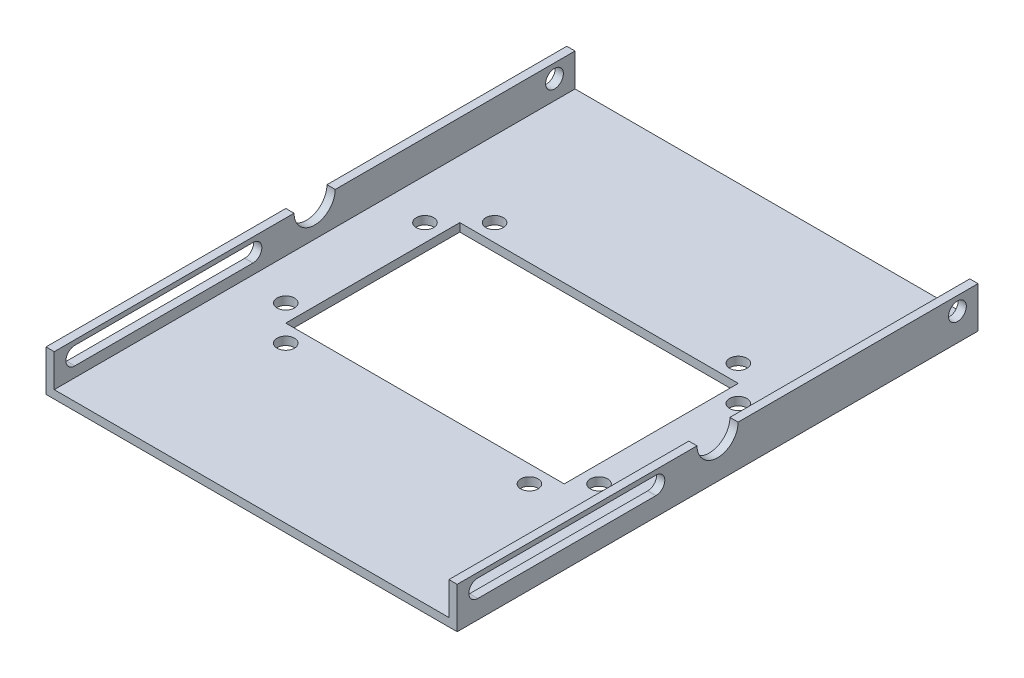
ISO-10303-21;
HEADER;
FILE_DESCRIPTION(('STEP AP214'),'2;1');
FILE_NAME('part.step','',(''),(''),'','','');
FILE_SCHEMA(('AUTOMOTIVE_DESIGN { 1 0 10303 214 1 1 1 1 }'));
ENDSEC;
DATA;
#1=APPLICATION_CONTEXT('core data for automotive mechanical design processes');
#2=APPLICATION_PROTOCOL_DEFINITION('international standard','automotive_design',2000,#1);
#3=PRODUCT_CONTEXT('',#1,'mechanical');
#4=PRODUCT('Part','Part','',(#3));
#5=PRODUCT_RELATED_PRODUCT_CATEGORY('part','',(#4));
#6=PRODUCT_DEFINITION_FORMATION('','',#4);
#7=PRODUCT_DEFINITION_CONTEXT('part definition',#1,'design');
#8=PRODUCT_DEFINITION('design','',#6,#7);
#9=PRODUCT_DEFINITION_SHAPE('','',#8);
#10=(LENGTH_UNIT() NAMED_UNIT(*) SI_UNIT(.MILLI.,.METRE.));
#11=(NAMED_UNIT(*) PLANE_ANGLE_UNIT() SI_UNIT($,.RADIAN.));
#12=(NAMED_UNIT(*) SI_UNIT($,.STERADIAN.) SOLID_ANGLE_UNIT());
#13=UNCERTAINTY_MEASURE_WITH_UNIT(LENGTH_MEASURE(1.E-05),#10,'distance_accuracy_value','');
#14=(GEOMETRIC_REPRESENTATION_CONTEXT(3) GLOBAL_UNCERTAINTY_ASSIGNED_CONTEXT((#13)) GLOBAL_UNIT_ASSIGNED_CONTEXT((#10,
#11,#12)) REPRESENTATION_CONTEXT('',''));
#15=CARTESIAN_POINT('',(0.,0.,0.));
#16=DIRECTION('',(0.,0.,1.));
#17=DIRECTION('',(1.,0.,0.));
#18=AXIS2_PLACEMENT_3D('',#15,#16,#17);
#19=CARTESIAN_POINT('',(-75.,15.,-95.));
#20=DIRECTION('',(0.,-1.,0.));
#21=DIRECTION('',(0.,0.,-1.));
#22=AXIS2_PLACEMENT_3D('',#19,#20,#21);
#23=PLANE('',#22);
#24=DIRECTION('',(0.,0.,1.));
#25=VECTOR('',#24,1.);
#26=CARTESIAN_POINT('',(-75.,15.,-95.));
#27=LINE('',#26,#25);
#28=CARTESIAN_POINT('',(-75.,15.,-95.));
#29=VERTEX_POINT('',#28);
#30=CARTESIAN_POINT('',(-75.,15.,-7.5));
#31=VERTEX_POINT('',#30);
#32=EDGE_CURVE('E390',#29,#31,#27,.T.);
#33=ORIENTED_EDGE('',*,*,#32,.T.);
#34=DIRECTION('',(1.,0.,0.));
#35=VECTOR('',#34,1.);
#36=CARTESIAN_POINT('',(-75.,15.,-7.5));
#37=LINE('',#36,#35);
#38=CARTESIAN_POINT('',(-72.,15.,-7.5));
#39=VERTEX_POINT('',#38);
#40=EDGE_CURVE('E278',#31,#39,#37,.T.);
#41=ORIENTED_EDGE('',*,*,#40,.T.);
#42=DIRECTION('',(0.,0.,1.));
#43=VECTOR('',#42,1.);
#44=CARTESIAN_POINT('',(-72.,15.,-95.));
#45=LINE('',#44,#43);
#46=CARTESIAN_POINT('',(-72.,15.,-95.));
#47=VERTEX_POINT('',#46);
#48=EDGE_CURVE('E394',#47,#39,#45,.T.);
#49=ORIENTED_EDGE('',*,*,#48,.F.);
#50=DIRECTION('',(1.,0.,0.));
#51=VECTOR('',#50,1.);
#52=CARTESIAN_POINT('',(-75.,15.,-95.));
#53=LINE('',#52,#51);
#54=EDGE_CURVE('E376',#29,#47,#53,.T.);
#55=ORIENTED_EDGE('',*,*,#54,.F.);
#56=EDGE_LOOP('',(#33,#41,#49,#55));
#57=FACE_BOUND('',#56,.T.);
#58=ADVANCED_FACE('F44',(#57),#23,.F.);
#59=CARTESIAN_POINT('',(72.,15.,-95.));
#60=DIRECTION('',(0.,-1.,0.));
#61=DIRECTION('',(0.,0.,-1.));
#62=AXIS2_PLACEMENT_3D('',#59,#60,#61);
#63=PLANE('',#62);
#64=DIRECTION('',(0.,0.,1.));
#65=VECTOR('',#64,1.);
#66=CARTESIAN_POINT('',(72.,15.,-95.));
#67=LINE('',#66,#65);
#68=CARTESIAN_POINT('',(72.,15.,-95.));
#69=VERTEX_POINT('',#68);
#70=CARTESIAN_POINT('',(72.,15.,-7.5));
#71=VERTEX_POINT('',#70);
#72=EDGE_CURVE('E402',#69,#71,#67,.T.);
#73=ORIENTED_EDGE('',*,*,#72,.T.);
#74=DIRECTION('',(1.,0.,0.));
#75=VECTOR('',#74,1.);
#76=CARTESIAN_POINT('',(-75.,15.,-7.5));
#77=LINE('',#76,#75);
#78=CARTESIAN_POINT('',(75.,15.,-7.5));
#79=VERTEX_POINT('',#78);
#80=EDGE_CURVE('E13',#71,#79,#77,.T.);
#81=ORIENTED_EDGE('',*,*,#80,.T.);
#82=DIRECTION('',(0.,0.,1.));
#83=VECTOR('',#82,1.);
#84=CARTESIAN_POINT('',(75.,15.,-95.));
#85=LINE('',#84,#83);
#86=CARTESIAN_POINT('',(75.,15.,-95.));
#87=VERTEX_POINT('',#86);
#88=EDGE_CURVE('E406',#87,#79,#85,.T.);
#89=ORIENTED_EDGE('',*,*,#88,.F.);
#90=DIRECTION('',(1.,0.,0.));
#91=VECTOR('',#90,1.);
#92=CARTESIAN_POINT('',(72.,15.,-95.));
#93=LINE('',#92,#91);
#94=EDGE_CURVE('E368',#69,#87,#93,.T.);
#95=ORIENTED_EDGE('',*,*,#94,.F.);
#96=EDGE_LOOP('',(#73,#81,#89,#95));
#97=FACE_BOUND('',#96,.T.);
#98=ADVANCED_FACE('F467',(#97),#63,.F.);
#99=CARTESIAN_POINT('',(75.,0.,-95.));
#100=DIRECTION('',(1.,0.,0.));
#101=DIRECTION('',(0.,0.,-1.));
#102=AXIS2_PLACEMENT_3D('',#99,#100,#101);
#103=PLANE('',#102);
#104=CARTESIAN_POINT('',(75.,15.,0.));
#105=DIRECTION('',(1.,0.,0.));
#106=DIRECTION('',(0.,0.,-1.));
#107=AXIS2_PLACEMENT_3D('',#104,#105,#106);
#108=CIRCLE('',#107,7.5);
#109=CARTESIAN_POINT('',(75.,15.,7.5));
#110=VERTEX_POINT('',#109);
#111=EDGE_CURVE('E270',#110,#79,#108,.T.);
#112=ORIENTED_EDGE('',*,*,#111,.F.);
#113=CARTESIAN_POINT('',(75.,15.,95.));
#114=VERTEX_POINT('',#113);
#115=EDGE_CURVE('E384',#110,#114,#85,.T.);
#116=ORIENTED_EDGE('',*,*,#115,.T.);
#117=DIRECTION('',(0.,1.,0.));
#118=VECTOR('',#117,1.);
#119=CARTESIAN_POINT('',(75.,0.,95.));
#120=LINE('',#119,#118);
#121=CARTESIAN_POINT('',(75.,0.,95.));
#122=VERTEX_POINT('',#121);
#123=EDGE_CURVE('E341',#122,#114,#120,.T.);
#124=ORIENTED_EDGE('',*,*,#123,.F.);
#125=DIRECTION('',(0.,0.,1.));
#126=VECTOR('',#125,1.);
#127=CARTESIAN_POINT('',(75.,0.,-95.));
#128=LINE('',#127,#126);
#129=CARTESIAN_POINT('',(75.,0.,-95.));
#130=VERTEX_POINT('',#129);
#131=EDGE_CURVE('E385',#130,#122,#128,.T.);
#132=ORIENTED_EDGE('',*,*,#131,.F.);
#133=DIRECTION('',(0.,1.,0.));
#134=VECTOR('',#133,1.);
#135=CARTESIAN_POINT('',(75.,0.,-95.));
#136=LINE('',#135,#134);
#137=EDGE_CURVE('E365',#130,#87,#136,.T.);
#138=ORIENTED_EDGE('',*,*,#137,.T.);
#139=ORIENTED_EDGE('',*,*,#88,.T.);
#140=EDGE_LOOP('',(#112,#116,#124,#132,#138,#139));
#141=FACE_BOUND('',#140,.T.);
#142=CARTESIAN_POINT('',(75.,10.,-87.5));
#143=DIRECTION('',(-1.,0.,0.));
#144=DIRECTION('',(0.,0.,1.));
#145=AXIS2_PLACEMENT_3D('',#142,#143,#144);
#146=CIRCLE('',#145,3.23850000000001);
#147=CARTESIAN_POINT('',(75.,10.,-84.2615));
#148=VERTEX_POINT('',#147);
#149=EDGE_CURVE('E282',#148,#148,#146,.T.);
#150=ORIENTED_EDGE('',*,*,#149,.T.);
#151=EDGE_LOOP('',(#150));
#152=FACE_BOUND('',#151,.T.);
#153=CARTESIAN_POINT('',(75.,10.,87.5));
#154=DIRECTION('',(-1.,0.,0.));
#155=DIRECTION('',(0.,0.,1.));
#156=AXIS2_PLACEMENT_3D('',#153,#154,#155);
#157=CIRCLE('',#156,3.2385);
#158=CARTESIAN_POINT('',(75.,6.76150000000002,87.5));
#159=VERTEX_POINT('',#158);
#160=CARTESIAN_POINT('',(75.,13.2385,87.5));
#161=VERTEX_POINT('',#160);
#162=EDGE_CURVE('E290',#159,#161,#157,.T.);
#163=ORIENTED_EDGE('',*,*,#162,.T.);
#164=DIRECTION('',(0.,0.,-1.));
#165=VECTOR('',#164,1.);
#166=CARTESIAN_POINT('',(75.,13.2385,87.5));
#167=LINE('',#166,#165);
#168=CARTESIAN_POINT('',(75.,13.2385,22.5));
#169=VERTEX_POINT('',#168);
#170=EDGE_CURVE('E293',#161,#169,#167,.T.);
#171=ORIENTED_EDGE('',*,*,#170,.T.);
#172=CARTESIAN_POINT('',(75.,10.,22.5));
#173=DIRECTION('',(-1.,0.,0.));
#174=DIRECTION('',(0.,0.,1.));
#175=AXIS2_PLACEMENT_3D('',#172,#173,#174);
#176=CIRCLE('',#175,3.2385);
#177=CARTESIAN_POINT('',(75.,6.76150000000001,22.5));
#178=VERTEX_POINT('',#177);
#179=EDGE_CURVE('E297',#169,#178,#176,.T.);
#180=ORIENTED_EDGE('',*,*,#179,.T.);
#181=DIRECTION('',(0.,0.,1.));
#182=VECTOR('',#181,1.);
#183=CARTESIAN_POINT('',(75.,6.76150000000002,87.5));
#184=LINE('',#183,#182);
#185=EDGE_CURVE('E300',#178,#159,#184,.T.);
#186=ORIENTED_EDGE('',*,*,#185,.T.);
#187=EDGE_LOOP('',(#163,#171,#180,#186));
#188=FACE_BOUND('',#187,.T.);
#189=ADVANCED_FACE('F46',(#141,#152,#188),#103,.T.);
#190=CARTESIAN_POINT('',(-75.,0.,-95.));
#191=DIRECTION('',(0.,-1.,0.));
#192=DIRECTION('',(0.,0.,-1.));
#193=AXIS2_PLACEMENT_3D('',#190,#191,#192);
#194=PLANE('',#193);
#195=CARTESIAN_POINT('',(-44.45,0.,-38.1));
#196=DIRECTION('',(0.,-1.,0.));
#197=DIRECTION('',(0.,0.,-1.));
#198=AXIS2_PLACEMENT_3D('',#195,#196,#197);
#199=CIRCLE('',#198,3.175);
#200=CARTESIAN_POINT('',(-44.45,0.,-41.275));
#201=VERTEX_POINT('',#200);
#202=EDGE_CURVE('E261',#201,#201,#199,.T.);
#203=ORIENTED_EDGE('',*,*,#202,.F.);
#204=EDGE_LOOP('',(#203));
#205=FACE_BOUND('',#204,.T.);
#206=CARTESIAN_POINT('',(44.45,0.,-38.1));
#207=DIRECTION('',(0.,-1.,0.));
#208=DIRECTION('',(0.,0.,-1.));
#209=AXIS2_PLACEMENT_3D('',#206,#207,#208);
#210=CIRCLE('',#209,3.175);
#211=CARTESIAN_POINT('',(44.45,0.,-41.275));
#212=VERTEX_POINT('',#211);
#213=EDGE_CURVE('E258',#212,#212,#210,.T.);
#214=ORIENTED_EDGE('',*,*,#213,.F.);
#215=EDGE_LOOP('',(#214));
#216=FACE_BOUND('',#215,.T.);
#217=CARTESIAN_POINT('',(-44.45,0.,38.1));
#218=DIRECTION('',(0.,-1.,0.));
#219=DIRECTION('',(0.,0.,-1.));
#220=AXIS2_PLACEMENT_3D('',#217,#218,#219);
#221=CIRCLE('',#220,3.175);
#222=CARTESIAN_POINT('',(-44.45,0.,34.925));
#223=VERTEX_POINT('',#222);
#224=EDGE_CURVE('E255',#223,#223,#221,.T.);
#225=ORIENTED_EDGE('',*,*,#224,.F.);
#226=EDGE_LOOP('',(#225));
#227=FACE_BOUND('',#226,.T.);
#228=CARTESIAN_POINT('',(44.45,0.,38.1));
#229=DIRECTION('',(0.,-1.,0.));
#230=DIRECTION('',(0.,0.,-1.));
#231=AXIS2_PLACEMENT_3D('',#228,#229,#230);
#232=CIRCLE('',#231,3.175);
#233=CARTESIAN_POINT('',(44.45,0.,34.925));
#234=VERTEX_POINT('',#233);
#235=EDGE_CURVE('E252',#234,#234,#232,.T.);
#236=ORIENTED_EDGE('',*,*,#235,.F.);
#237=EDGE_LOOP('',(#236));
#238=FACE_BOUND('',#237,.T.);
#239=CARTESIAN_POINT('',(-57.15,0.,-25.4));
#240=DIRECTION('',(0.,-1.,0.));
#241=DIRECTION('',(0.,0.,-1.));
#242=AXIS2_PLACEMENT_3D('',#239,#240,#241);
#243=CIRCLE('',#242,3.17499999999997);
#244=CARTESIAN_POINT('',(-57.15,0.,-28.575));
#245=VERTEX_POINT('',#244);
#246=EDGE_CURVE('E249',#245,#245,#243,.T.);
#247=ORIENTED_EDGE('',*,*,#246,.F.);
#248=EDGE_LOOP('',(#247));
#249=FACE_BOUND('',#248,.T.);
#250=CARTESIAN_POINT('',(57.15,0.,-25.4));
#251=DIRECTION('',(0.,-1.,0.));
#252=DIRECTION('',(0.,0.,-1.));
#253=AXIS2_PLACEMENT_3D('',#250,#251,#252);
#254=CIRCLE('',#253,3.175);
#255=CARTESIAN_POINT('',(57.15,0.,-28.575));
#256=VERTEX_POINT('',#255);
#257=EDGE_CURVE('E246',#256,#256,#254,.T.);
#258=ORIENTED_EDGE('',*,*,#257,.F.);
#259=EDGE_LOOP('',(#258));
#260=FACE_BOUND('',#259,.T.);
#261=CARTESIAN_POINT('',(-57.15,0.,25.4));
#262=DIRECTION('',(0.,-1.,0.));
#263=DIRECTION('',(0.,0.,-1.));
#264=AXIS2_PLACEMENT_3D('',#261,#262,#263);
#265=CIRCLE('',#264,3.17499999999996);
#266=CARTESIAN_POINT('',(-57.15,0.,22.225));
#267=VERTEX_POINT('',#266);
#268=EDGE_CURVE('E243',#267,#267,#265,.T.);
#269=ORIENTED_EDGE('',*,*,#268,.F.);
#270=EDGE_LOOP('',(#269));
#271=FACE_BOUND('',#270,.T.);
#272=CARTESIAN_POINT('',(57.15,0.,25.4));
#273=DIRECTION('',(0.,-1.,0.));
#274=DIRECTION('',(0.,0.,-1.));
#275=AXIS2_PLACEMENT_3D('',#272,#273,#274);
#276=CIRCLE('',#275,3.175);
#277=CARTESIAN_POINT('',(57.15,0.,22.225));
#278=VERTEX_POINT('',#277);
#279=EDGE_CURVE('E240',#278,#278,#276,.T.);
#280=ORIENTED_EDGE('',*,*,#279,.F.);
#281=EDGE_LOOP('',(#280));
#282=FACE_BOUND('',#281,.T.);
#283=DIRECTION('',(0.,0.,1.));
#284=VECTOR('',#283,1.);
#285=CARTESIAN_POINT('',(50.8,0.,-95.));
#286=LINE('',#285,#284);
#287=CARTESIAN_POINT('',(50.8,0.,-31.75));
#288=VERTEX_POINT('',#287);
#289=CARTESIAN_POINT('',(50.8,0.,31.75));
#290=VERTEX_POINT('',#289);
#291=EDGE_CURVE('E238',#288,#290,#286,.T.);
#292=ORIENTED_EDGE('',*,*,#291,.F.);
#293=DIRECTION('',(1.,0.,0.));
#294=VECTOR('',#293,1.);
#295=CARTESIAN_POINT('',(-75.,0.,-31.75));
#296=LINE('',#295,#294);
#297=CARTESIAN_POINT('',(-50.8,0.,-31.75));
#298=VERTEX_POINT('',#297);
#299=EDGE_CURVE('E231',#298,#288,#296,.T.);
#300=ORIENTED_EDGE('',*,*,#299,.F.);
#301=DIRECTION('',(0.,0.,-1.));
#302=VECTOR('',#301,1.);
#303=CARTESIAN_POINT('',(-50.8,0.,-95.));
#304=LINE('',#303,#302);
#305=CARTESIAN_POINT('',(-50.8,0.,31.75));
#306=VERTEX_POINT('',#305);
#307=EDGE_CURVE('E211',#306,#298,#304,.T.);
#308=ORIENTED_EDGE('',*,*,#307,.F.);
#309=DIRECTION('',(-1.,0.,0.));
#310=VECTOR('',#309,1.);
#311=CARTESIAN_POINT('',(-75.,0.,31.75));
#312=LINE('',#311,#310);
#313=EDGE_CURVE('E236',#290,#306,#312,.T.);
#314=ORIENTED_EDGE('',*,*,#313,.F.);
#315=EDGE_LOOP('',(#292,#300,#308,#314));
#316=FACE_BOUND('',#315,.T.);
#317=ORIENTED_EDGE('',*,*,#131,.T.);
#318=DIRECTION('',(1.,0.,0.));
#319=VECTOR('',#318,1.);
#320=CARTESIAN_POINT('',(-75.,0.,95.));
#321=LINE('',#320,#319);
#322=CARTESIAN_POINT('',(-75.,0.,95.));
#323=VERTEX_POINT('',#322);
#324=EDGE_CURVE('E362',#323,#122,#321,.T.);
#325=ORIENTED_EDGE('',*,*,#324,.F.);
#326=DIRECTION('',(0.,0.,1.));
#327=VECTOR('',#326,1.);
#328=CARTESIAN_POINT('',(-75.,0.,-95.));
#329=LINE('',#328,#327);
#330=CARTESIAN_POINT('',(-75.,0.,-95.));
#331=VERTEX_POINT('',#330);
#332=EDGE_CURVE('E388',#331,#323,#329,.T.);
#333=ORIENTED_EDGE('',*,*,#332,.F.);
#334=DIRECTION('',(1.,0.,0.));
#335=VECTOR('',#334,1.);
#336=CARTESIAN_POINT('',(-75.,0.,-95.));
#337=LINE('',#336,#335);
#338=EDGE_CURVE('E381',#331,#130,#337,.T.);
#339=ORIENTED_EDGE('',*,*,#338,.T.);
#340=EDGE_LOOP('',(#317,#325,#333,#339));
#341=FACE_BOUND('',#340,.T.);
#342=ADVANCED_FACE('F456',(#205,#216,#227,#238,#249,#260,#271,#282,#316,#341),#194,.T.);
#343=CARTESIAN_POINT('',(-75.,0.,-95.));
#344=DIRECTION('',(-1.,0.,0.));
#345=DIRECTION('',(0.,0.,1.));
#346=AXIS2_PLACEMENT_3D('',#343,#344,#345);
#347=PLANE('',#346);
#348=CARTESIAN_POINT('',(-75.,15.,0.));
#349=DIRECTION('',(1.,0.,0.));
#350=DIRECTION('',(0.,0.,-1.));
#351=AXIS2_PLACEMENT_3D('',#348,#349,#350);
#352=CIRCLE('',#351,7.5);
#353=CARTESIAN_POINT('',(-75.,15.,7.5));
#354=VERTEX_POINT('',#353);
#355=EDGE_CURVE('E264',#354,#31,#352,.T.);
#356=ORIENTED_EDGE('',*,*,#355,.T.);
#357=ORIENTED_EDGE('',*,*,#32,.F.);
#358=DIRECTION('',(0.,-1.,0.));
#359=VECTOR('',#358,1.);
#360=CARTESIAN_POINT('',(-75.,0.,-95.));
#361=LINE('',#360,#359);
#362=EDGE_CURVE('E378',#29,#331,#361,.T.);
#363=ORIENTED_EDGE('',*,*,#362,.T.);
#364=ORIENTED_EDGE('',*,*,#332,.T.);
#365=DIRECTION('',(0.,-1.,0.));
#366=VECTOR('',#365,1.);
#367=CARTESIAN_POINT('',(-75.,0.,95.));
#368=LINE('',#367,#366);
#369=CARTESIAN_POINT('',(-75.,15.,95.));
#370=VERTEX_POINT('',#369);
#371=EDGE_CURVE('E359',#370,#323,#368,.T.);
#372=ORIENTED_EDGE('',*,*,#371,.F.);
#373=EDGE_CURVE('E393',#354,#370,#27,.T.);
#374=ORIENTED_EDGE('',*,*,#373,.F.);
#375=EDGE_LOOP('',(#356,#357,#363,#364,#372,#374));
#376=FACE_BOUND('',#375,.T.);
#377=CARTESIAN_POINT('',(-75.,10.,-87.5));
#378=DIRECTION('',(-1.,0.,0.));
#379=DIRECTION('',(0.,0.,1.));
#380=AXIS2_PLACEMENT_3D('',#377,#378,#379);
#381=CIRCLE('',#380,3.23850000000001);
#382=CARTESIAN_POINT('',(-75.,10.,-84.2615));
#383=VERTEX_POINT('',#382);
#384=EDGE_CURVE('E286',#383,#383,#381,.T.);
#385=ORIENTED_EDGE('',*,*,#384,.F.);
#386=EDGE_LOOP('',(#385));
#387=FACE_BOUND('',#386,.T.);
#388=CARTESIAN_POINT('',(-75.,10.,87.5));
#389=DIRECTION('',(-1.,0.,0.));
#390=DIRECTION('',(0.,0.,1.));
#391=AXIS2_PLACEMENT_3D('',#388,#389,#390);
#392=CIRCLE('',#391,3.2385);
#393=CARTESIAN_POINT('',(-75.,6.76150000000002,87.5));
#394=VERTEX_POINT('',#393);
#395=CARTESIAN_POINT('',(-75.,13.2385,87.5));
#396=VERTEX_POINT('',#395);
#397=EDGE_CURVE('E281',#394,#396,#392,.T.);
#398=ORIENTED_EDGE('',*,*,#397,.F.);
#399=DIRECTION('',(0.,0.,1.));
#400=VECTOR('',#399,1.);
#401=CARTESIAN_POINT('',(-75.,6.76150000000002,87.5));
#402=LINE('',#401,#400);
#403=CARTESIAN_POINT('',(-75.,6.76150000000001,22.5));
#404=VERTEX_POINT('',#403);
#405=EDGE_CURVE('E294',#404,#394,#402,.T.);
#406=ORIENTED_EDGE('',*,*,#405,.F.);
#407=CARTESIAN_POINT('',(-75.,10.,22.5));
#408=DIRECTION('',(-1.,0.,0.));
#409=DIRECTION('',(0.,0.,1.));
#410=AXIS2_PLACEMENT_3D('',#407,#408,#409);
#411=CIRCLE('',#410,3.2385);
#412=CARTESIAN_POINT('',(-75.,13.2385,22.5));
#413=VERTEX_POINT('',#412);
#414=EDGE_CURVE('E308',#413,#404,#411,.T.);
#415=ORIENTED_EDGE('',*,*,#414,.F.);
#416=DIRECTION('',(0.,0.,-1.));
#417=VECTOR('',#416,1.);
#418=CARTESIAN_POINT('',(-75.,13.2385,87.5));
#419=LINE('',#418,#417);
#420=EDGE_CURVE('E305',#396,#413,#419,.T.);
#421=ORIENTED_EDGE('',*,*,#420,.F.);
#422=EDGE_LOOP('',(#398,#406,#415,#421));
#423=FACE_BOUND('',#422,.T.);
#424=ADVANCED_FACE('F451',(#376,#387,#423),#347,.T.);
#425=CARTESIAN_POINT('',(-72.,15.,7.5));
#426=VERTEX_POINT('',#425);
#427=CARTESIAN_POINT('',(-72.,15.,95.));
#428=VERTEX_POINT('',#427);
#429=EDGE_CURVE('E397',#426,#428,#45,.T.);
#430=ORIENTED_EDGE('',*,*,#429,.F.);
#431=DIRECTION('',(1.,0.,0.));
#432=VECTOR('',#431,1.);
#433=CARTESIAN_POINT('',(-75.,15.,7.5));
#434=LINE('',#433,#432);
#435=EDGE_CURVE('E275',#426,#354,#434,.F.);
#436=ORIENTED_EDGE('',*,*,#435,.T.);
#437=ORIENTED_EDGE('',*,*,#373,.T.);
#438=DIRECTION('',(1.,0.,0.));
#439=VECTOR('',#438,1.);
#440=CARTESIAN_POINT('',(-75.,15.,95.));
#441=LINE('',#440,#439);
#442=EDGE_CURVE('E356',#370,#428,#441,.T.);
#443=ORIENTED_EDGE('',*,*,#442,.T.);
#444=EDGE_LOOP('',(#430,#436,#437,#443));
#445=FACE_BOUND('',#444,.T.);
#446=ADVANCED_FACE('F447',(#445),#23,.F.);
#447=CARTESIAN_POINT('',(-72.,0.,-95.));
#448=DIRECTION('',(-1.,0.,0.));
#449=DIRECTION('',(0.,0.,1.));
#450=AXIS2_PLACEMENT_3D('',#447,#448,#449);
#451=PLANE('',#450);
#452=CARTESIAN_POINT('',(-72.,10.,-87.5));
#453=DIRECTION('',(-1.,0.,0.));
#454=DIRECTION('',(0.,0.,1.));
#455=AXIS2_PLACEMENT_3D('',#452,#453,#454);
#456=CIRCLE('',#455,3.23850000000001);
#457=CARTESIAN_POINT('',(-72.,10.,-84.2615));
#458=VERTEX_POINT('',#457);
#459=EDGE_CURVE('E338',#458,#458,#456,.T.);
#460=ORIENTED_EDGE('',*,*,#459,.T.);
#461=EDGE_LOOP('',(#460));
#462=FACE_BOUND('',#461,.T.);
#463=DIRECTION('',(0.,0.,1.));
#464=VECTOR('',#463,1.);
#465=CARTESIAN_POINT('',(-72.,6.7615,-95.));
#466=LINE('',#465,#464);
#467=CARTESIAN_POINT('',(-72.,6.76150000000001,22.5));
#468=VERTEX_POINT('',#467);
#469=CARTESIAN_POINT('',(-72.,6.76150000000002,87.5));
#470=VERTEX_POINT('',#469);
#471=EDGE_CURVE('E331',#468,#470,#466,.T.);
#472=ORIENTED_EDGE('',*,*,#471,.T.);
#473=CARTESIAN_POINT('',(-72.,10.,87.5));
#474=DIRECTION('',(-1.,0.,0.));
#475=DIRECTION('',(0.,0.,1.));
#476=AXIS2_PLACEMENT_3D('',#473,#474,#475);
#477=CIRCLE('',#476,3.2385);
#478=CARTESIAN_POINT('',(-72.,13.2385,87.5));
#479=VERTEX_POINT('',#478);
#480=EDGE_CURVE('E334',#470,#479,#477,.T.);
#481=ORIENTED_EDGE('',*,*,#480,.T.);
#482=DIRECTION('',(0.,0.,-1.));
#483=VECTOR('',#482,1.);
#484=CARTESIAN_POINT('',(-72.,13.2385,-95.));
#485=LINE('',#484,#483);
#486=CARTESIAN_POINT('',(-72.,13.2385,22.5));
#487=VERTEX_POINT('',#486);
#488=EDGE_CURVE('E285',#479,#487,#485,.T.);
#489=ORIENTED_EDGE('',*,*,#488,.T.);
#490=CARTESIAN_POINT('',(-72.,10.,22.5));
#491=DIRECTION('',(-1.,0.,0.));
#492=DIRECTION('',(0.,0.,1.));
#493=AXIS2_PLACEMENT_3D('',#490,#491,#492);
#494=CIRCLE('',#493,3.2385);
#495=EDGE_CURVE('E328',#487,#468,#494,.T.);
#496=ORIENTED_EDGE('',*,*,#495,.T.);
#497=EDGE_LOOP('',(#472,#481,#489,#496));
#498=FACE_BOUND('',#497,.T.);
#499=ORIENTED_EDGE('',*,*,#48,.T.);
#500=CARTESIAN_POINT('',(-72.,15.,0.));
#501=DIRECTION('',(-1.,0.,0.));
#502=DIRECTION('',(0.,0.,1.));
#503=AXIS2_PLACEMENT_3D('',#500,#501,#502);
#504=CIRCLE('',#503,7.5);
#505=EDGE_CURVE('E272',#39,#426,#504,.T.);
#506=ORIENTED_EDGE('',*,*,#505,.T.);
#507=ORIENTED_EDGE('',*,*,#429,.T.);
#508=DIRECTION('',(0.,1.,0.));
#509=VECTOR('',#508,1.);
#510=CARTESIAN_POINT('',(-72.,0.,95.));
#511=LINE('',#510,#509);
#512=CARTESIAN_POINT('',(-72.,3.,95.));
#513=VERTEX_POINT('',#512);
#514=EDGE_CURVE('E353',#428,#513,#511,.F.);
#515=ORIENTED_EDGE('',*,*,#514,.T.);
#516=DIRECTION('',(0.,0.,1.));
#517=VECTOR('',#516,1.);
#518=CARTESIAN_POINT('',(-72.,3.,-95.));
#519=LINE('',#518,#517);
#520=CARTESIAN_POINT('',(-72.,3.,-95.));
#521=VERTEX_POINT('',#520);
#522=EDGE_CURVE('E398',#521,#513,#519,.T.);
#523=ORIENTED_EDGE('',*,*,#522,.F.);
#524=DIRECTION('',(0.,1.,0.));
#525=VECTOR('',#524,1.);
#526=CARTESIAN_POINT('',(-72.,0.,-95.));
#527=LINE('',#526,#525);
#528=EDGE_CURVE('E374',#47,#521,#527,.F.);
#529=ORIENTED_EDGE('',*,*,#528,.F.);
#530=EDGE_LOOP('',(#499,#506,#507,#515,#523,#529));
#531=FACE_BOUND('',#530,.T.);
#532=ADVANCED_FACE('F443',(#462,#498,#531),#451,.F.);
#533=CARTESIAN_POINT('',(-75.,3.,-95.));
#534=DIRECTION('',(0.,-1.,0.));
#535=DIRECTION('',(0.,0.,-1.));
#536=AXIS2_PLACEMENT_3D('',#533,#534,#535);
#537=PLANE('',#536);
#538=CARTESIAN_POINT('',(-44.45,3.,-38.1));
#539=DIRECTION('',(0.,1.,0.));
#540=DIRECTION('',(0.,0.,1.));
#541=AXIS2_PLACEMENT_3D('',#538,#539,#540);
#542=CIRCLE('',#541,3.175);
#543=CARTESIAN_POINT('',(-44.45,3.,-34.925));
#544=VERTEX_POINT('',#543);
#545=EDGE_CURVE('E698',#544,#544,#542,.T.);
#546=ORIENTED_EDGE('',*,*,#545,.F.);
#547=EDGE_LOOP('',(#546));
#548=FACE_BOUND('',#547,.T.);
#549=CARTESIAN_POINT('',(44.45,3.,-38.1));
#550=DIRECTION('',(0.,1.,0.));
#551=DIRECTION('',(0.,0.,1.));
#552=AXIS2_PLACEMENT_3D('',#549,#550,#551);
#553=CIRCLE('',#552,3.175);
#554=CARTESIAN_POINT('',(44.45,3.,-34.925));
#555=VERTEX_POINT('',#554);
#556=EDGE_CURVE('E699',#555,#555,#553,.T.);
#557=ORIENTED_EDGE('',*,*,#556,.F.);
#558=EDGE_LOOP('',(#557));
#559=FACE_BOUND('',#558,.T.);
#560=CARTESIAN_POINT('',(-44.45,3.,38.1));
#561=DIRECTION('',(0.,1.,0.));
#562=DIRECTION('',(0.,0.,1.));
#563=AXIS2_PLACEMENT_3D('',#560,#561,#562);
#564=CIRCLE('',#563,3.175);
#565=CARTESIAN_POINT('',(-44.45,3.,41.275));
#566=VERTEX_POINT('',#565);
#567=EDGE_CURVE('E702',#566,#566,#564,.T.);
#568=ORIENTED_EDGE('',*,*,#567,.F.);
#569=EDGE_LOOP('',(#568));
#570=FACE_BOUND('',#569,.T.);
#571=CARTESIAN_POINT('',(44.45,3.,38.1));
#572=DIRECTION('',(0.,1.,0.));
#573=DIRECTION('',(0.,0.,1.));
#574=AXIS2_PLACEMENT_3D('',#571,#572,#573);
#575=CIRCLE('',#574,3.175);
#576=CARTESIAN_POINT('',(44.45,3.,41.275));
#577=VERTEX_POINT('',#576);
#578=EDGE_CURVE('E710',#577,#577,#575,.T.);
#579=ORIENTED_EDGE('',*,*,#578,.F.);
#580=EDGE_LOOP('',(#579));
#581=FACE_BOUND('',#580,.T.);
#582=CARTESIAN_POINT('',(-57.15,3.,-25.4));
#583=DIRECTION('',(0.,1.,0.));
#584=DIRECTION('',(0.,0.,1.));
#585=AXIS2_PLACEMENT_3D('',#582,#583,#584);
#586=CIRCLE('',#585,3.17499999999997);
#587=CARTESIAN_POINT('',(-57.15,3.,-22.225));
#588=VERTEX_POINT('',#587);
#589=EDGE_CURVE('E712',#588,#588,#586,.T.);
#590=ORIENTED_EDGE('',*,*,#589,.F.);
#591=EDGE_LOOP('',(#590));
#592=FACE_BOUND('',#591,.T.);
#593=CARTESIAN_POINT('',(57.15,3.,-25.4));
#594=DIRECTION('',(0.,1.,0.));
#595=DIRECTION('',(0.,0.,1.));
#596=AXIS2_PLACEMENT_3D('',#593,#594,#595);
#597=CIRCLE('',#596,3.175);
#598=CARTESIAN_POINT('',(57.15,3.,-22.225));
#599=VERTEX_POINT('',#598);
#600=EDGE_CURVE('E716',#599,#599,#597,.T.);
#601=ORIENTED_EDGE('',*,*,#600,.F.);
#602=EDGE_LOOP('',(#601));
#603=FACE_BOUND('',#602,.T.);
#604=CARTESIAN_POINT('',(-57.15,3.,25.4));
#605=DIRECTION('',(0.,1.,0.));
#606=DIRECTION('',(0.,0.,1.));
#607=AXIS2_PLACEMENT_3D('',#604,#605,#606);
#608=CIRCLE('',#607,3.17499999999996);
#609=CARTESIAN_POINT('',(-57.15,3.,28.575));
#610=VERTEX_POINT('',#609);
#611=EDGE_CURVE('E721',#610,#610,#608,.T.);
#612=ORIENTED_EDGE('',*,*,#611,.F.);
#613=EDGE_LOOP('',(#612));
#614=FACE_BOUND('',#613,.T.);
#615=CARTESIAN_POINT('',(57.15,3.,25.4));
#616=DIRECTION('',(0.,1.,0.));
#617=DIRECTION('',(0.,0.,1.));
#618=AXIS2_PLACEMENT_3D('',#615,#616,#617);
#619=CIRCLE('',#618,3.175);
#620=CARTESIAN_POINT('',(57.15,3.,28.575));
#621=VERTEX_POINT('',#620);
#622=EDGE_CURVE('E705',#621,#621,#619,.T.);
#623=ORIENTED_EDGE('',*,*,#622,.F.);
#624=EDGE_LOOP('',(#623));
#625=FACE_BOUND('',#624,.T.);
#626=DIRECTION('',(-1.,0.,0.));
#627=VECTOR('',#626,1.);
#628=CARTESIAN_POINT('',(-50.8,3.,-31.75));
#629=LINE('',#628,#627);
#630=CARTESIAN_POINT('',(50.8,3.,-31.75));
#631=VERTEX_POINT('',#630);
#632=CARTESIAN_POINT('',(-50.8,3.,-31.75));
#633=VERTEX_POINT('',#632);
#634=EDGE_CURVE('E217',#631,#633,#629,.T.);
#635=ORIENTED_EDGE('',*,*,#634,.F.);
#636=DIRECTION('',(0.,0.,-1.));
#637=VECTOR('',#636,1.);
#638=CARTESIAN_POINT('',(50.8,3.,-31.75));
#639=LINE('',#638,#637);
#640=CARTESIAN_POINT('',(50.8,3.,31.75));
#641=VERTEX_POINT('',#640);
#642=EDGE_CURVE('E67',#641,#631,#639,.T.);
#643=ORIENTED_EDGE('',*,*,#642,.F.);
#644=DIRECTION('',(1.,0.,0.));
#645=VECTOR('',#644,1.);
#646=CARTESIAN_POINT('',(-50.8,3.,31.75));
#647=LINE('',#646,#645);
#648=CARTESIAN_POINT('',(-50.8,3.,31.75));
#649=VERTEX_POINT('',#648);
#650=EDGE_CURVE('E224',#649,#641,#647,.T.);
#651=ORIENTED_EDGE('',*,*,#650,.F.);
#652=DIRECTION('',(0.,0.,1.));
#653=VECTOR('',#652,1.);
#654=CARTESIAN_POINT('',(-50.8,3.,-31.75));
#655=LINE('',#654,#653);
#656=EDGE_CURVE('E208',#633,#649,#655,.T.);
#657=ORIENTED_EDGE('',*,*,#656,.F.);
#658=EDGE_LOOP('',(#635,#643,#651,#657));
#659=FACE_BOUND('',#658,.T.);
#660=ORIENTED_EDGE('',*,*,#522,.T.);
#661=DIRECTION('',(1.,0.,0.));
#662=VECTOR('',#661,1.);
#663=CARTESIAN_POINT('',(-75.,3.,95.));
#664=LINE('',#663,#662);
#665=CARTESIAN_POINT('',(72.,3.,95.));
#666=VERTEX_POINT('',#665);
#667=EDGE_CURVE('E350',#513,#666,#664,.T.);
#668=ORIENTED_EDGE('',*,*,#667,.T.);
#669=DIRECTION('',(0.,0.,1.));
#670=VECTOR('',#669,1.);
#671=CARTESIAN_POINT('',(72.,3.,-95.));
#672=LINE('',#671,#670);
#673=CARTESIAN_POINT('',(72.,3.,-95.));
#674=VERTEX_POINT('',#673);
#675=EDGE_CURVE('E400',#674,#666,#672,.T.);
#676=ORIENTED_EDGE('',*,*,#675,.F.);
#677=DIRECTION('',(1.,0.,0.));
#678=VECTOR('',#677,1.);
#679=CARTESIAN_POINT('',(-75.,3.,-95.));
#680=LINE('',#679,#678);
#681=EDGE_CURVE('E372',#521,#674,#680,.T.);
#682=ORIENTED_EDGE('',*,*,#681,.F.);
#683=EDGE_LOOP('',(#660,#668,#676,#682));
#684=FACE_BOUND('',#683,.T.);
#685=ADVANCED_FACE('F221',(#548,#559,#570,#581,#592,#603,#614,#625,#659,#684),#537,.F.);
#686=CARTESIAN_POINT('',(72.,0.,-95.));
#687=DIRECTION('',(1.,0.,0.));
#688=DIRECTION('',(0.,0.,-1.));
#689=AXIS2_PLACEMENT_3D('',#686,#687,#688);
#690=PLANE('',#689);
#691=CARTESIAN_POINT('',(72.,10.,-87.5));
#692=DIRECTION('',(1.,0.,0.));
#693=DIRECTION('',(0.,0.,-1.));
#694=AXIS2_PLACEMENT_3D('',#691,#692,#693);
#695=CIRCLE('',#694,3.23850000000001);
#696=CARTESIAN_POINT('',(72.,10.,-90.7385));
#697=VERTEX_POINT('',#696);
#698=EDGE_CURVE('E337',#697,#697,#695,.T.);
#699=ORIENTED_EDGE('',*,*,#698,.T.);
#700=EDGE_LOOP('',(#699));
#701=FACE_BOUND('',#700,.T.);
#702=DIRECTION('',(0.,0.,1.));
#703=VECTOR('',#702,1.);
#704=CARTESIAN_POINT('',(72.,13.2385,-95.));
#705=LINE('',#704,#703);
#706=CARTESIAN_POINT('',(72.,13.2385,22.5));
#707=VERTEX_POINT('',#706);
#708=CARTESIAN_POINT('',(72.,13.2385,87.5));
#709=VERTEX_POINT('',#708);
#710=EDGE_CURVE('E387',#707,#709,#705,.T.);
#711=ORIENTED_EDGE('',*,*,#710,.T.);
#712=CARTESIAN_POINT('',(72.,10.,87.5));
#713=DIRECTION('',(1.,0.,0.));
#714=DIRECTION('',(0.,0.,-1.));
#715=AXIS2_PLACEMENT_3D('',#712,#713,#714);
#716=CIRCLE('',#715,3.2385);
#717=CARTESIAN_POINT('',(72.,6.76150000000002,87.5));
#718=VERTEX_POINT('',#717);
#719=EDGE_CURVE('E417',#709,#718,#716,.T.);
#720=ORIENTED_EDGE('',*,*,#719,.T.);
#721=DIRECTION('',(0.,0.,-1.));
#722=VECTOR('',#721,1.);
#723=CARTESIAN_POINT('',(72.,6.7615,-95.));
#724=LINE('',#723,#722);
#725=CARTESIAN_POINT('',(72.,6.76150000000001,22.5));
#726=VERTEX_POINT('',#725);
#727=EDGE_CURVE('E414',#718,#726,#724,.T.);
#728=ORIENTED_EDGE('',*,*,#727,.T.);
#729=CARTESIAN_POINT('',(72.,10.,22.5));
#730=DIRECTION('',(1.,0.,0.));
#731=DIRECTION('',(0.,0.,-1.));
#732=AXIS2_PLACEMENT_3D('',#729,#730,#731);
#733=CIRCLE('',#732,3.2385);
#734=EDGE_CURVE('E411',#726,#707,#733,.T.);
#735=ORIENTED_EDGE('',*,*,#734,.T.);
#736=EDGE_LOOP('',(#711,#720,#728,#735));
#737=FACE_BOUND('',#736,.T.);
#738=CARTESIAN_POINT('',(72.,15.,7.50000000000001));
#739=VERTEX_POINT('',#738);
#740=CARTESIAN_POINT('',(72.,15.,95.));
#741=VERTEX_POINT('',#740);
#742=EDGE_CURVE('E405',#739,#741,#67,.T.);
#743=ORIENTED_EDGE('',*,*,#742,.F.);
#744=CARTESIAN_POINT('',(72.,15.,0.));
#745=DIRECTION('',(1.,0.,0.));
#746=DIRECTION('',(0.,0.,-1.));
#747=AXIS2_PLACEMENT_3D('',#744,#745,#746);
#748=CIRCLE('',#747,7.5);
#749=EDGE_CURVE('E267',#739,#71,#748,.T.);
#750=ORIENTED_EDGE('',*,*,#749,.T.);
#751=ORIENTED_EDGE('',*,*,#72,.F.);
#752=DIRECTION('',(0.,1.,0.));
#753=VECTOR('',#752,1.);
#754=CARTESIAN_POINT('',(72.,0.,-95.));
#755=LINE('',#754,#753);
#756=EDGE_CURVE('E370',#674,#69,#755,.T.);
#757=ORIENTED_EDGE('',*,*,#756,.F.);
#758=ORIENTED_EDGE('',*,*,#675,.T.);
#759=DIRECTION('',(0.,1.,0.));
#760=VECTOR('',#759,1.);
#761=CARTESIAN_POINT('',(72.,0.,95.));
#762=LINE('',#761,#760);
#763=EDGE_CURVE('E347',#666,#741,#762,.T.);
#764=ORIENTED_EDGE('',*,*,#763,.T.);
#765=EDGE_LOOP('',(#743,#750,#751,#757,#758,#764));
#766=FACE_BOUND('',#765,.T.);
#767=ADVANCED_FACE('F430',(#701,#737,#766),#690,.F.);
#768=ORIENTED_EDGE('',*,*,#115,.F.);
#769=DIRECTION('',(1.,0.,0.));
#770=VECTOR('',#769,1.);
#771=CARTESIAN_POINT('',(-75.,15.,7.5));
#772=LINE('',#771,#770);
#773=EDGE_CURVE('E52',#110,#739,#772,.F.);
#774=ORIENTED_EDGE('',*,*,#773,.T.);
#775=ORIENTED_EDGE('',*,*,#742,.T.);
#776=DIRECTION('',(1.,0.,0.));
#777=VECTOR('',#776,1.);
#778=CARTESIAN_POINT('',(72.,15.,95.));
#779=LINE('',#778,#777);
#780=EDGE_CURVE('E344',#741,#114,#779,.T.);
#781=ORIENTED_EDGE('',*,*,#780,.T.);
#782=EDGE_LOOP('',(#768,#774,#775,#781));
#783=FACE_BOUND('',#782,.T.);
#784=ADVANCED_FACE('F425',(#783),#63,.F.);
#785=CARTESIAN_POINT('',(0.,0.,-95.));
#786=DIRECTION('',(0.,0.,-1.));
#787=DIRECTION('',(-1.,0.,0.));
#788=AXIS2_PLACEMENT_3D('',#785,#786,#787);
#789=PLANE('',#788);
#790=ORIENTED_EDGE('',*,*,#137,.F.);
#791=ORIENTED_EDGE('',*,*,#338,.F.);
#792=ORIENTED_EDGE('',*,*,#362,.F.);
#793=ORIENTED_EDGE('',*,*,#54,.T.);
#794=ORIENTED_EDGE('',*,*,#528,.T.);
#795=ORIENTED_EDGE('',*,*,#681,.T.);
#796=ORIENTED_EDGE('',*,*,#756,.T.);
#797=ORIENTED_EDGE('',*,*,#94,.T.);
#798=EDGE_LOOP('',(#790,#791,#792,#793,#794,#795,#796,#797));
#799=FACE_BOUND('',#798,.T.);
#800=ADVANCED_FACE('F462',(#799),#789,.T.);
#801=CARTESIAN_POINT('',(0.,0.,95.));
#802=DIRECTION('',(0.,0.,-1.));
#803=DIRECTION('',(-1.,0.,0.));
#804=AXIS2_PLACEMENT_3D('',#801,#802,#803);
#805=PLANE('',#804);
#806=ORIENTED_EDGE('',*,*,#123,.T.);
#807=ORIENTED_EDGE('',*,*,#780,.F.);
#808=ORIENTED_EDGE('',*,*,#763,.F.);
#809=ORIENTED_EDGE('',*,*,#667,.F.);
#810=ORIENTED_EDGE('',*,*,#514,.F.);
#811=ORIENTED_EDGE('',*,*,#442,.F.);
#812=ORIENTED_EDGE('',*,*,#371,.T.);
#813=ORIENTED_EDGE('',*,*,#324,.T.);
#814=EDGE_LOOP('',(#806,#807,#808,#809,#810,#811,#812,#813));
#815=FACE_BOUND('',#814,.T.);
#816=ADVANCED_FACE('F437',(#815),#805,.F.);
#817=CARTESIAN_POINT('',(75.,13.2385,87.5));
#818=DIRECTION('',(0.,1.,0.));
#819=DIRECTION('',(0.,0.,1.));
#820=AXIS2_PLACEMENT_3D('',#817,#818,#819);
#821=PLANE('',#820);
#822=DIRECTION('',(-1.,0.,0.));
#823=VECTOR('',#822,1.);
#824=CARTESIAN_POINT('',(75.,13.2385,22.5));
#825=LINE('',#824,#823);
#826=EDGE_CURVE('E320',#169,#707,#825,.T.);
#827=ORIENTED_EDGE('',*,*,#826,.F.);
#828=ORIENTED_EDGE('',*,*,#170,.F.);
#829=DIRECTION('',(-1.,0.,0.));
#830=VECTOR('',#829,1.);
#831=CARTESIAN_POINT('',(75.,13.2385,87.5));
#832=LINE('',#831,#830);
#833=EDGE_CURVE('E324',#161,#709,#832,.T.);
#834=ORIENTED_EDGE('',*,*,#833,.T.);
#835=ORIENTED_EDGE('',*,*,#710,.F.);
#836=EDGE_LOOP('',(#827,#828,#834,#835));
#837=FACE_BOUND('',#836,.T.);
#838=ADVANCED_FACE('F509',(#837),#821,.F.);
#839=CARTESIAN_POINT('',(75.,10.,22.5));
#840=DIRECTION('',(-1.,0.,0.));
#841=DIRECTION('',(0.,0.,1.));
#842=AXIS2_PLACEMENT_3D('',#839,#840,#841);
#843=CYLINDRICAL_SURFACE('',#842,3.2385);
#844=DIRECTION('',(-1.,0.,0.));
#845=VECTOR('',#844,1.);
#846=CARTESIAN_POINT('',(75.,6.76150000000001,22.5));
#847=LINE('',#846,#845);
#848=EDGE_CURVE('E316',#178,#726,#847,.T.);
#849=ORIENTED_EDGE('',*,*,#848,.F.);
#850=ORIENTED_EDGE('',*,*,#179,.F.);
#851=ORIENTED_EDGE('',*,*,#826,.T.);
#852=ORIENTED_EDGE('',*,*,#734,.F.);
#853=EDGE_LOOP('',(#849,#850,#851,#852));
#854=FACE_BOUND('',#853,.T.);
#855=ADVANCED_FACE('F523',(#854),#843,.F.);
#856=CARTESIAN_POINT('',(75.,6.76150000000002,87.5));
#857=DIRECTION('',(0.,-1.,0.));
#858=DIRECTION('',(0.,0.,-1.));
#859=AXIS2_PLACEMENT_3D('',#856,#857,#858);
#860=PLANE('',#859);
#861=DIRECTION('',(-1.,0.,0.));
#862=VECTOR('',#861,1.);
#863=CARTESIAN_POINT('',(75.,6.76150000000002,87.5));
#864=LINE('',#863,#862);
#865=EDGE_CURVE('E289',#159,#718,#864,.T.);
#866=ORIENTED_EDGE('',*,*,#865,.F.);
#867=ORIENTED_EDGE('',*,*,#185,.F.);
#868=ORIENTED_EDGE('',*,*,#848,.T.);
#869=ORIENTED_EDGE('',*,*,#727,.F.);
#870=EDGE_LOOP('',(#866,#867,#868,#869));
#871=FACE_BOUND('',#870,.T.);
#872=ADVANCED_FACE('F526',(#871),#860,.F.);
#873=CARTESIAN_POINT('',(75.,10.,87.5));
#874=DIRECTION('',(-1.,0.,0.));
#875=DIRECTION('',(0.,0.,1.));
#876=AXIS2_PLACEMENT_3D('',#873,#874,#875);
#877=CYLINDRICAL_SURFACE('',#876,3.2385);
#878=ORIENTED_EDGE('',*,*,#833,.F.);
#879=ORIENTED_EDGE('',*,*,#162,.F.);
#880=ORIENTED_EDGE('',*,*,#865,.T.);
#881=ORIENTED_EDGE('',*,*,#719,.F.);
#882=EDGE_LOOP('',(#878,#879,#880,#881));
#883=FACE_BOUND('',#882,.T.);
#884=ADVANCED_FACE('F515',(#883),#877,.F.);
#885=CARTESIAN_POINT('',(75.,10.,-87.5));
#886=DIRECTION('',(-1.,0.,0.));
#887=DIRECTION('',(0.,0.,1.));
#888=AXIS2_PLACEMENT_3D('',#885,#886,#887);
#889=CYLINDRICAL_SURFACE('',#888,3.23850000000001);
#890=ORIENTED_EDGE('',*,*,#149,.F.);
#891=EDGE_LOOP('',(#890));
#892=FACE_BOUND('',#891,.T.);
#893=ORIENTED_EDGE('',*,*,#698,.F.);
#894=EDGE_LOOP('',(#893));
#895=FACE_BOUND('',#894,.T.);
#896=ADVANCED_FACE('F482',(#892,#895),#889,.F.);
#897=EDGE_CURVE('E315',#470,#394,#864,.T.);
#898=ORIENTED_EDGE('',*,*,#897,.T.);
#899=ORIENTED_EDGE('',*,*,#397,.T.);
#900=EDGE_CURVE('E303',#479,#396,#832,.T.);
#901=ORIENTED_EDGE('',*,*,#900,.F.);
#902=ORIENTED_EDGE('',*,*,#480,.F.);
#903=EDGE_LOOP('',(#898,#899,#901,#902));
#904=FACE_BOUND('',#903,.T.);
#905=ADVANCED_FACE('F510',(#904),#877,.F.);
#906=EDGE_CURVE('E319',#468,#404,#847,.T.);
#907=ORIENTED_EDGE('',*,*,#906,.T.);
#908=ORIENTED_EDGE('',*,*,#405,.T.);
#909=ORIENTED_EDGE('',*,*,#897,.F.);
#910=ORIENTED_EDGE('',*,*,#471,.F.);
#911=EDGE_LOOP('',(#907,#908,#909,#910));
#912=FACE_BOUND('',#911,.T.);
#913=ADVANCED_FACE('F513',(#912),#860,.F.);
#914=EDGE_CURVE('E323',#487,#413,#825,.T.);
#915=ORIENTED_EDGE('',*,*,#914,.T.);
#916=ORIENTED_EDGE('',*,*,#414,.T.);
#917=ORIENTED_EDGE('',*,*,#906,.F.);
#918=ORIENTED_EDGE('',*,*,#495,.F.);
#919=EDGE_LOOP('',(#915,#916,#917,#918));
#920=FACE_BOUND('',#919,.T.);
#921=ADVANCED_FACE('F518',(#920),#843,.F.);
#922=ORIENTED_EDGE('',*,*,#900,.T.);
#923=ORIENTED_EDGE('',*,*,#420,.T.);
#924=ORIENTED_EDGE('',*,*,#914,.F.);
#925=ORIENTED_EDGE('',*,*,#488,.F.);
#926=EDGE_LOOP('',(#922,#923,#924,#925));
#927=FACE_BOUND('',#926,.T.);
#928=ADVANCED_FACE('F479',(#927),#821,.F.);
#929=ORIENTED_EDGE('',*,*,#384,.T.);
#930=EDGE_LOOP('',(#929));
#931=FACE_BOUND('',#930,.T.);
#932=ORIENTED_EDGE('',*,*,#459,.F.);
#933=EDGE_LOOP('',(#932));
#934=FACE_BOUND('',#933,.T.);
#935=ADVANCED_FACE('F471',(#931,#934),#889,.F.);
#936=CARTESIAN_POINT('',(-75.,15.,0.));
#937=DIRECTION('',(1.,0.,0.));
#938=DIRECTION('',(0.,0.,-1.));
#939=AXIS2_PLACEMENT_3D('',#936,#937,#938);
#940=CYLINDRICAL_SURFACE('',#939,7.5);
#941=ORIENTED_EDGE('',*,*,#749,.F.);
#942=ORIENTED_EDGE('',*,*,#773,.F.);
#943=ORIENTED_EDGE('',*,*,#111,.T.);
#944=ORIENTED_EDGE('',*,*,#80,.F.);
#945=EDGE_LOOP('',(#941,#942,#943,#944));
#946=FACE_BOUND('',#945,.T.);
#947=ADVANCED_FACE('F468',(#946),#940,.F.);
#948=ORIENTED_EDGE('',*,*,#355,.F.);
#949=ORIENTED_EDGE('',*,*,#435,.F.);
#950=ORIENTED_EDGE('',*,*,#505,.F.);
#951=ORIENTED_EDGE('',*,*,#40,.F.);
#952=EDGE_LOOP('',(#948,#949,#950,#951));
#953=FACE_BOUND('',#952,.T.);
#954=ADVANCED_FACE('F470',(#953),#940,.F.);
#955=CARTESIAN_POINT('',(50.8,-7.,-31.75));
#956=DIRECTION('',(1.,0.,0.));
#957=DIRECTION('',(0.,0.,-1.));
#958=AXIS2_PLACEMENT_3D('',#955,#956,#957);
#959=PLANE('',#958);
#960=ORIENTED_EDGE('',*,*,#291,.T.);
#961=DIRECTION('',(0.,1.,0.));
#962=VECTOR('',#961,1.);
#963=CARTESIAN_POINT('',(50.8,-7.,31.75));
#964=LINE('',#963,#962);
#965=EDGE_CURVE('E229',#290,#641,#964,.T.);
#966=ORIENTED_EDGE('',*,*,#965,.T.);
#967=ORIENTED_EDGE('',*,*,#642,.T.);
#968=DIRECTION('',(0.,1.,0.));
#969=VECTOR('',#968,1.);
#970=CARTESIAN_POINT('',(50.8,-7.,-31.75));
#971=LINE('',#970,#969);
#972=EDGE_CURVE('E214',#288,#631,#971,.T.);
#973=ORIENTED_EDGE('',*,*,#972,.F.);
#974=EDGE_LOOP('',(#960,#966,#967,#973));
#975=FACE_BOUND('',#974,.T.);
#976=ADVANCED_FACE('F477',(#975),#959,.F.);
#977=CARTESIAN_POINT('',(-50.8,-7.,31.75));
#978=DIRECTION('',(0.,0.,1.));
#979=DIRECTION('',(1.,0.,0.));
#980=AXIS2_PLACEMENT_3D('',#977,#978,#979);
#981=PLANE('',#980);
#982=ORIENTED_EDGE('',*,*,#313,.T.);
#983=DIRECTION('',(0.,1.,0.));
#984=VECTOR('',#983,1.);
#985=CARTESIAN_POINT('',(-50.8,-7.,31.75));
#986=LINE('',#985,#984);
#987=EDGE_CURVE('E213',#306,#649,#986,.T.);
#988=ORIENTED_EDGE('',*,*,#987,.T.);
#989=ORIENTED_EDGE('',*,*,#650,.T.);
#990=ORIENTED_EDGE('',*,*,#965,.F.);
#991=EDGE_LOOP('',(#982,#988,#989,#990));
#992=FACE_BOUND('',#991,.T.);
#993=ADVANCED_FACE('F586',(#992),#981,.F.);
#994=CARTESIAN_POINT('',(-50.8,-7.,-31.75));
#995=DIRECTION('',(-1.,0.,0.));
#996=DIRECTION('',(0.,0.,1.));
#997=AXIS2_PLACEMENT_3D('',#994,#995,#996);
#998=PLANE('',#997);
#999=ORIENTED_EDGE('',*,*,#307,.T.);
#1000=DIRECTION('',(0.,1.,0.));
#1001=VECTOR('',#1000,1.);
#1002=CARTESIAN_POINT('',(-50.8,-7.,-31.75));
#1003=LINE('',#1002,#1001);
#1004=EDGE_CURVE('E59',#298,#633,#1003,.T.);
#1005=ORIENTED_EDGE('',*,*,#1004,.T.);
#1006=ORIENTED_EDGE('',*,*,#656,.T.);
#1007=ORIENTED_EDGE('',*,*,#987,.F.);
#1008=EDGE_LOOP('',(#999,#1005,#1006,#1007));
#1009=FACE_BOUND('',#1008,.T.);
#1010=ADVANCED_FACE('F205',(#1009),#998,.F.);
#1011=CARTESIAN_POINT('',(-50.8,-7.,-31.75));
#1012=DIRECTION('',(0.,0.,-1.));
#1013=DIRECTION('',(-1.,0.,0.));
#1014=AXIS2_PLACEMENT_3D('',#1011,#1012,#1013);
#1015=PLANE('',#1014);
#1016=ORIENTED_EDGE('',*,*,#299,.T.);
#1017=ORIENTED_EDGE('',*,*,#972,.T.);
#1018=ORIENTED_EDGE('',*,*,#634,.T.);
#1019=ORIENTED_EDGE('',*,*,#1004,.F.);
#1020=EDGE_LOOP('',(#1016,#1017,#1018,#1019));
#1021=FACE_BOUND('',#1020,.T.);
#1022=ADVANCED_FACE('F218',(#1021),#1015,.F.);
#1023=CARTESIAN_POINT('',(57.15,-7.,25.4));
#1024=DIRECTION('',(0.,1.,0.));
#1025=DIRECTION('',(0.,0.,1.));
#1026=AXIS2_PLACEMENT_3D('',#1023,#1024,#1025);
#1027=CYLINDRICAL_SURFACE('',#1026,3.175);
#1028=ORIENTED_EDGE('',*,*,#279,.T.);
#1029=EDGE_LOOP('',(#1028));
#1030=FACE_BOUND('',#1029,.T.);
#1031=ORIENTED_EDGE('',*,*,#622,.T.);
#1032=EDGE_LOOP('',(#1031));
#1033=FACE_BOUND('',#1032,.T.);
#1034=ADVANCED_FACE('F611',(#1030,#1033),#1027,.F.);
#1035=CARTESIAN_POINT('',(-57.15,-7.,25.4));
#1036=DIRECTION('',(0.,1.,0.));
#1037=DIRECTION('',(0.,0.,1.));
#1038=AXIS2_PLACEMENT_3D('',#1035,#1036,#1037);
#1039=CYLINDRICAL_SURFACE('',#1038,3.17499999999996);
#1040=ORIENTED_EDGE('',*,*,#268,.T.);
#1041=EDGE_LOOP('',(#1040));
#1042=FACE_BOUND('',#1041,.T.);
#1043=ORIENTED_EDGE('',*,*,#611,.T.);
#1044=EDGE_LOOP('',(#1043));
#1045=FACE_BOUND('',#1044,.T.);
#1046=ADVANCED_FACE('F620',(#1042,#1045),#1039,.F.);
#1047=CARTESIAN_POINT('',(57.15,-7.,-25.4));
#1048=DIRECTION('',(0.,1.,0.));
#1049=DIRECTION('',(0.,0.,1.));
#1050=AXIS2_PLACEMENT_3D('',#1047,#1048,#1049);
#1051=CYLINDRICAL_SURFACE('',#1050,3.175);
#1052=ORIENTED_EDGE('',*,*,#257,.T.);
#1053=EDGE_LOOP('',(#1052));
#1054=FACE_BOUND('',#1053,.T.);
#1055=ORIENTED_EDGE('',*,*,#600,.T.);
#1056=EDGE_LOOP('',(#1055));
#1057=FACE_BOUND('',#1056,.T.);
#1058=ADVANCED_FACE('F630',(#1054,#1057),#1051,.F.);
#1059=CARTESIAN_POINT('',(-57.15,-7.,-25.4));
#1060=DIRECTION('',(0.,1.,0.));
#1061=DIRECTION('',(0.,0.,1.));
#1062=AXIS2_PLACEMENT_3D('',#1059,#1060,#1061);
#1063=CYLINDRICAL_SURFACE('',#1062,3.17499999999997);
#1064=ORIENTED_EDGE('',*,*,#246,.T.);
#1065=EDGE_LOOP('',(#1064));
#1066=FACE_BOUND('',#1065,.T.);
#1067=ORIENTED_EDGE('',*,*,#589,.T.);
#1068=EDGE_LOOP('',(#1067));
#1069=FACE_BOUND('',#1068,.T.);
#1070=ADVANCED_FACE('F640',(#1066,#1069),#1063,.F.);
#1071=CARTESIAN_POINT('',(44.45,-7.,38.1));
#1072=DIRECTION('',(0.,1.,0.));
#1073=DIRECTION('',(0.,0.,1.));
#1074=AXIS2_PLACEMENT_3D('',#1071,#1072,#1073);
#1075=CYLINDRICAL_SURFACE('',#1074,3.175);
#1076=ORIENTED_EDGE('',*,*,#235,.T.);
#1077=EDGE_LOOP('',(#1076));
#1078=FACE_BOUND('',#1077,.T.);
#1079=ORIENTED_EDGE('',*,*,#578,.T.);
#1080=EDGE_LOOP('',(#1079));
#1081=FACE_BOUND('',#1080,.T.);
#1082=ADVANCED_FACE('F650',(#1078,#1081),#1075,.F.);
#1083=CARTESIAN_POINT('',(-44.45,-7.,38.1));
#1084=DIRECTION('',(0.,1.,0.));
#1085=DIRECTION('',(0.,0.,1.));
#1086=AXIS2_PLACEMENT_3D('',#1083,#1084,#1085);
#1087=CYLINDRICAL_SURFACE('',#1086,3.175);
#1088=ORIENTED_EDGE('',*,*,#224,.T.);
#1089=EDGE_LOOP('',(#1088));
#1090=FACE_BOUND('',#1089,.T.);
#1091=ORIENTED_EDGE('',*,*,#567,.T.);
#1092=EDGE_LOOP('',(#1091));
#1093=FACE_BOUND('',#1092,.T.);
#1094=ADVANCED_FACE('F660',(#1090,#1093),#1087,.F.);
#1095=CARTESIAN_POINT('',(44.45,-7.,-38.1));
#1096=DIRECTION('',(0.,1.,0.));
#1097=DIRECTION('',(0.,0.,1.));
#1098=AXIS2_PLACEMENT_3D('',#1095,#1096,#1097);
#1099=CYLINDRICAL_SURFACE('',#1098,3.175);
#1100=ORIENTED_EDGE('',*,*,#213,.T.);
#1101=EDGE_LOOP('',(#1100));
#1102=FACE_BOUND('',#1101,.T.);
#1103=ORIENTED_EDGE('',*,*,#556,.T.);
#1104=EDGE_LOOP('',(#1103));
#1105=FACE_BOUND('',#1104,.T.);
#1106=ADVANCED_FACE('F670',(#1102,#1105),#1099,.F.);
#1107=CARTESIAN_POINT('',(-44.45,-7.,-38.1));
#1108=DIRECTION('',(0.,1.,0.));
#1109=DIRECTION('',(0.,0.,1.));
#1110=AXIS2_PLACEMENT_3D('',#1107,#1108,#1109);
#1111=CYLINDRICAL_SURFACE('',#1110,3.175);
#1112=ORIENTED_EDGE('',*,*,#202,.T.);
#1113=EDGE_LOOP('',(#1112));
#1114=FACE_BOUND('',#1113,.T.);
#1115=ORIENTED_EDGE('',*,*,#545,.T.);
#1116=EDGE_LOOP('',(#1115));
#1117=FACE_BOUND('',#1116,.T.);
#1118=ADVANCED_FACE('F680',(#1114,#1117),#1111,.F.);
#1119=CLOSED_SHELL('',(#58,#98,#189,#342,#424,#446,#532,#685,#767,#784,#800,#816,#838,#855,#872,
#884,#896,#905,#913,#921,#928,#935,#947,#954,#976,#993,#1010,#1022,#1034,#1046,#1058,#1070,
#1082,#1094,#1106,#1118));
#1120=MANIFOLD_SOLID_BREP('B2',#1119);
#1121=ADVANCED_BREP_SHAPE_REPRESENTATION('',(#18,#1120),#14);
#1122=SHAPE_DEFINITION_REPRESENTATION(#9,#1121);
ENDSEC;
END-ISO-10303-21;
